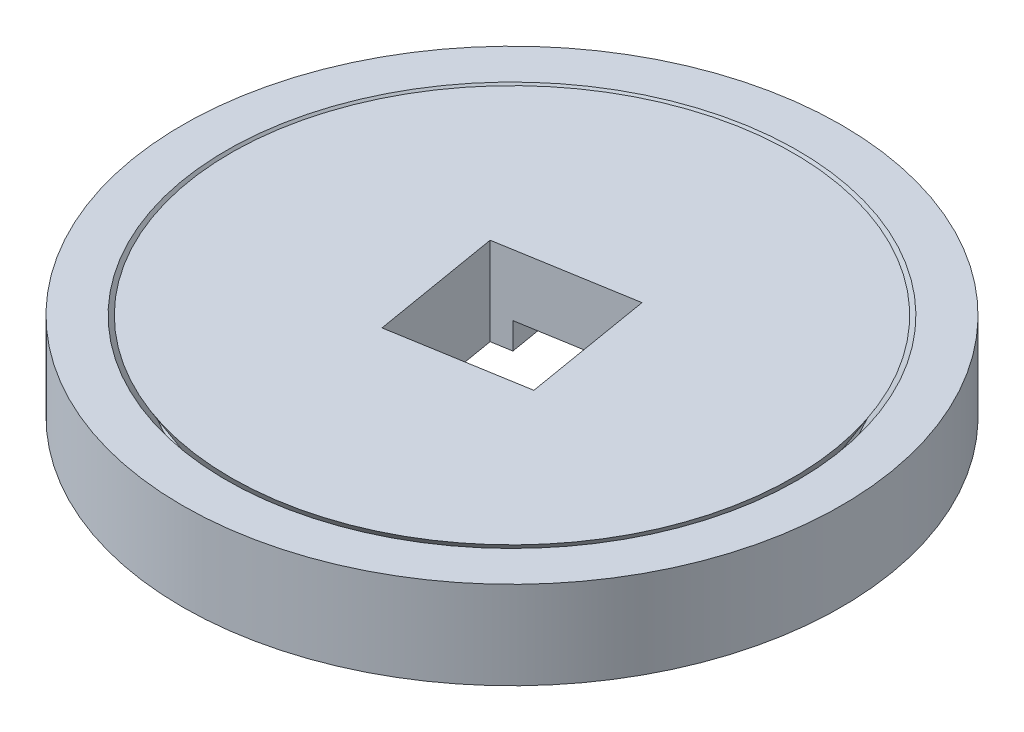
ISO-10303-21;
HEADER;
FILE_DESCRIPTION(('STEP AP214'),'2;1');
FILE_NAME('part.step','',(''),(''),'','','');
FILE_SCHEMA(('AUTOMOTIVE_DESIGN { 1 0 10303 214 1 1 1 1 }'));
ENDSEC;
DATA;
#1=APPLICATION_CONTEXT('core data for automotive mechanical design processes');
#2=APPLICATION_PROTOCOL_DEFINITION('international standard','automotive_design',2000,#1);
#3=PRODUCT_CONTEXT('',#1,'mechanical');
#4=PRODUCT('Part','Part','',(#3));
#5=PRODUCT_RELATED_PRODUCT_CATEGORY('part','',(#4));
#6=PRODUCT_DEFINITION_FORMATION('','',#4);
#7=PRODUCT_DEFINITION_CONTEXT('part definition',#1,'design');
#8=PRODUCT_DEFINITION('design','',#6,#7);
#9=PRODUCT_DEFINITION_SHAPE('','',#8);
#10=(LENGTH_UNIT() NAMED_UNIT(*) SI_UNIT(.MILLI.,.METRE.));
#11=(NAMED_UNIT(*) PLANE_ANGLE_UNIT() SI_UNIT($,.RADIAN.));
#12=(NAMED_UNIT(*) SI_UNIT($,.STERADIAN.) SOLID_ANGLE_UNIT());
#13=UNCERTAINTY_MEASURE_WITH_UNIT(LENGTH_MEASURE(1.E-05),#10,'distance_accuracy_value','');
#14=(GEOMETRIC_REPRESENTATION_CONTEXT(3) GLOBAL_UNCERTAINTY_ASSIGNED_CONTEXT((#13)) GLOBAL_UNIT_ASSIGNED_CONTEXT((#10,
#11,#12)) REPRESENTATION_CONTEXT('',''));
#15=CARTESIAN_POINT('',(0.,0.,0.));
#16=DIRECTION('',(0.,0.,1.));
#17=DIRECTION('',(1.,0.,0.));
#18=AXIS2_PLACEMENT_3D('',#15,#16,#17);
#19=CARTESIAN_POINT('',(0.,0.,0.));
#20=DIRECTION('',(0.,1.,0.));
#21=DIRECTION('',(0.165939621193172,0.,0.986135914627526));
#22=AXIS2_PLACEMENT_3D('',#19,#20,#21);
#23=PLANE('',#22);
#24=CARTESIAN_POINT('',(0.,0.,0.));
#25=DIRECTION('',(0.,1.,0.));
#26=DIRECTION('',(0.165939621193172,0.,0.986135914627526));
#27=AXIS2_PLACEMENT_3D('',#24,#25,#26);
#28=CIRCLE('',#27,32.);
#29=CARTESIAN_POINT('',(31.5563492680808,0.,-5.3100678781815));
#30=VERTEX_POINT('',#29);
#31=EDGE_CURVE('P0_E19',#30,#30,#28,.T.);
#32=ORIENTED_EDGE('',*,*,#31,.F.);
#33=EDGE_LOOP('',(#32));
#34=FACE_BOUND('',#33,.T.);
#35=DIRECTION('',(0.165939621193172,0.,0.986135914627526));
#36=VECTOR('',#35,1.);
#37=CARTESIAN_POINT('',(6.4217607107433,0.,6.5248363484423));
#38=LINE('',#37,#36);
#39=CARTESIAN_POINT('',(6.4217607107433,0.,6.5248363484423));
#40=VERTEX_POINT('',#39);
#41=CARTESIAN_POINT('',(8.1641267332716,0.,16.8792634520313));
#42=VERTEX_POINT('',#41);
#43=EDGE_CURVE('P0_E125',#40,#42,#38,.T.);
#44=ORIENTED_EDGE('',*,*,#43,.F.);
#45=DIRECTION('',(0.986135914627526,0.,-0.165939621193172));
#46=VECTOR('',#45,1.);
#47=CARTESIAN_POINT('',(-6.15147220075766,0.,8.64056651865523));
#48=LINE('',#47,#46);
#49=CARTESIAN_POINT('',(8.64056651865523,0.,6.15147220075765));
#50=VERTEX_POINT('',#49);
#51=EDGE_CURVE('P0_E190',#40,#50,#48,.T.);
#52=ORIENTED_EDGE('',*,*,#51,.T.);
#53=DIRECTION('',(-0.165939621193172,0.,-0.986135914627526));
#54=VECTOR('',#53,1.);
#55=CARTESIAN_POINT('',(8.64056651865523,0.,6.15147220075765));
#56=LINE('',#55,#54);
#57=CARTESIAN_POINT('',(6.15147220075765,0.,-8.64056651865523));
#58=VERTEX_POINT('',#57);
#59=EDGE_CURVE('P0_E176',#50,#58,#56,.T.);
#60=ORIENTED_EDGE('',*,*,#59,.T.);
#61=DIRECTION('',(-0.986135914627526,0.,0.165939621193172));
#62=VECTOR('',#61,1.);
#63=CARTESIAN_POINT('',(-8.64056651865523,0.,-6.15147220075765));
#64=LINE('',#63,#62);
#65=CARTESIAN_POINT('',(3.93266639284572,0.,-8.2672023709706));
#66=VERTEX_POINT('',#65);
#67=EDGE_CURVE('P0_E185',#58,#66,#64,.T.);
#68=ORIENTED_EDGE('',*,*,#67,.T.);
#69=DIRECTION('',(0.165939621193172,0.,0.986135914627526));
#70=VECTOR('',#69,1.);
#71=CARTESIAN_POINT('',(3.93266639284572,0.,-8.2672023709706));
#72=LINE('',#71,#70);
#73=CARTESIAN_POINT('',(2.19030037031742,0.,-18.6216294745596));
#74=VERTEX_POINT('',#73);
#75=EDGE_CURVE('P0_E141',#74,#66,#72,.T.);
#76=ORIENTED_EDGE('',*,*,#75,.F.);
#77=DIRECTION('',(0.986135914627526,0.,-0.165939621193172));
#78=VECTOR('',#77,1.);
#79=CARTESIAN_POINT('',(2.19030037031742,0.,-18.6216294745596));
#80=LINE('',#79,#78);
#81=CARTESIAN_POINT('',(-8.1641267332716,0.,-16.8792634520313));
#82=VERTEX_POINT('',#81);
#83=EDGE_CURVE('P0_E165',#82,#74,#80,.T.);
#84=ORIENTED_EDGE('',*,*,#83,.F.);
#85=DIRECTION('',(-0.165939621193171,0.,-0.986135914627526));
#86=VECTOR('',#85,1.);
#87=CARTESIAN_POINT('',(-6.4217607107433,0.,-6.52483634844229));
#88=LINE('',#87,#86);
#89=CARTESIAN_POINT('',(-6.4217607107433,0.,-6.52483634844229));
#90=VERTEX_POINT('',#89);
#91=EDGE_CURVE('P0_E164',#90,#82,#88,.T.);
#92=ORIENTED_EDGE('',*,*,#91,.F.);
#93=CARTESIAN_POINT('',(-8.64056651865523,0.,-6.15147220075765));
#94=VERTEX_POINT('',#93);
#95=EDGE_CURVE('P0_E177',#90,#94,#64,.T.);
#96=ORIENTED_EDGE('',*,*,#95,.T.);
#97=DIRECTION('',(0.165939621193172,0.,0.986135914627526));
#98=VECTOR('',#97,1.);
#99=CARTESIAN_POINT('',(-6.15147220075766,0.,8.64056651865523));
#100=LINE('',#99,#98);
#101=CARTESIAN_POINT('',(-6.15147220075766,0.,8.64056651865523));
#102=VERTEX_POINT('',#101);
#103=EDGE_CURVE('P0_E182',#94,#102,#100,.T.);
#104=ORIENTED_EDGE('',*,*,#103,.T.);
#105=CARTESIAN_POINT('',(-3.93266639284572,0.,8.2672023709706));
#106=VERTEX_POINT('',#105);
#107=EDGE_CURVE('P0_E187',#102,#106,#48,.T.);
#108=ORIENTED_EDGE('',*,*,#107,.T.);
#109=DIRECTION('',(-0.165939621193172,0.,-0.986135914627526));
#110=VECTOR('',#109,1.);
#111=CARTESIAN_POINT('',(-3.93266639284572,0.,8.2672023709706));
#112=LINE('',#111,#110);
#113=CARTESIAN_POINT('',(-2.19030037031742,0.,18.6216294745596));
#114=VERTEX_POINT('',#113);
#115=EDGE_CURVE('P0_E134',#114,#106,#112,.T.);
#116=ORIENTED_EDGE('',*,*,#115,.F.);
#117=DIRECTION('',(-0.986135914627526,0.,0.165939621193172));
#118=VECTOR('',#117,1.);
#119=CARTESIAN_POINT('',(8.1641267332716,0.,16.8792634520313));
#120=LINE('',#119,#118);
#121=EDGE_CURVE('P0_E140',#42,#114,#120,.T.);
#122=ORIENTED_EDGE('',*,*,#121,.F.);
#123=EDGE_LOOP('',(#44,#52,#60,#68,#76,#84,#92,#96,#104,#108,#116,#122));
#124=FACE_BOUND('',#123,.T.);
#125=ADVANCED_FACE('P0_F16',(#34,#124),#23,.F.);
#126=CARTESIAN_POINT('',(0.,10.,0.));
#127=DIRECTION('',(0.,1.,0.));
#128=DIRECTION('',(0.165939621193172,0.,0.986135914627526));
#129=AXIS2_PLACEMENT_3D('',#126,#127,#128);
#130=PLANE('',#129);
#131=DIRECTION('',(-0.165939621193172,0.,-0.986135914627526));
#132=VECTOR('',#131,1.);
#133=CARTESIAN_POINT('',(8.64056651865523,10.,6.15147220075765));
#134=LINE('',#133,#132);
#135=CARTESIAN_POINT('',(8.64056651865523,10.,6.15147220075765));
#136=VERTEX_POINT('',#135);
#137=CARTESIAN_POINT('',(6.15147220075765,10.,-8.64056651865523));
#138=VERTEX_POINT('',#137);
#139=EDGE_CURVE('P0_E150',#136,#138,#134,.T.);
#140=ORIENTED_EDGE('',*,*,#139,.F.);
#141=DIRECTION('',(0.986135914627526,0.,-0.165939621193172));
#142=VECTOR('',#141,1.);
#143=CARTESIAN_POINT('',(-6.15147220075766,10.,8.64056651865523));
#144=LINE('',#143,#142);
#145=CARTESIAN_POINT('',(-6.15147220075766,10.,8.64056651865523));
#146=VERTEX_POINT('',#145);
#147=EDGE_CURVE('P0_E179',#146,#136,#144,.T.);
#148=ORIENTED_EDGE('',*,*,#147,.F.);
#149=DIRECTION('',(0.165939621193172,0.,0.986135914627526));
#150=VECTOR('',#149,1.);
#151=CARTESIAN_POINT('',(-6.15147220075766,10.,8.64056651865523));
#152=LINE('',#151,#150);
#153=CARTESIAN_POINT('',(-8.64056651865523,10.,-6.15147220075765));
#154=VERTEX_POINT('',#153);
#155=EDGE_CURVE('P0_E198',#154,#146,#152,.T.);
#156=ORIENTED_EDGE('',*,*,#155,.F.);
#157=DIRECTION('',(-0.986135914627526,0.,0.165939621193172));
#158=VECTOR('',#157,1.);
#159=CARTESIAN_POINT('',(-8.64056651865523,10.,-6.15147220075765));
#160=LINE('',#159,#158);
#161=EDGE_CURVE('P0_E194',#138,#154,#160,.T.);
#162=ORIENTED_EDGE('',*,*,#161,.F.);
#163=EDGE_LOOP('',(#140,#148,#156,#162));
#164=FACE_BOUND('',#163,.T.);
#165=CARTESIAN_POINT('',(0.,10.,0.));
#166=DIRECTION('',(0.,1.,0.));
#167=DIRECTION('',(0.165939621193172,0.,0.986135914627526));
#168=AXIS2_PLACEMENT_3D('',#165,#166,#167);
#169=CIRCLE('',#168,32.);
#170=CARTESIAN_POINT('',(31.5563492680808,10.,-5.3100678781815));
#171=VERTEX_POINT('',#170);
#172=EDGE_CURVE('P0_E10',#171,#171,#169,.T.);
#173=ORIENTED_EDGE('',*,*,#172,.T.);
#174=EDGE_LOOP('',(#173));
#175=FACE_BOUND('',#174,.T.);
#176=ADVANCED_FACE('P0_F223',(#164,#175),#130,.T.);
#177=CARTESIAN_POINT('',(0.,10.,0.));
#178=DIRECTION('',(0.,1.,0.));
#179=DIRECTION('',(0.165939621193172,0.,0.986135914627526));
#180=AXIS2_PLACEMENT_3D('',#177,#178,#179);
#181=CONICAL_SURFACE('',#180,32.,0.540419500270584);
#182=DIRECTION('',(-0.507362742350503,-0.857492925712544,0.0853752307611385));
#183=VECTOR('',#182,1.);
#184=CARTESIAN_POINT('',(31.5563492680808,10.,-5.3100678781815));
#185=LINE('',#184,#183);
#186=CARTESIAN_POINT('',(28.5979415241982,5.,-4.81224901460198));
#187=VERTEX_POINT('',#186);
#188=EDGE_CURVE('P0_E201',#171,#187,#185,.T.);
#189=ORIENTED_EDGE('',*,*,#188,.F.);
#190=ORIENTED_EDGE('',*,*,#172,.F.);
#191=ORIENTED_EDGE('',*,*,#188,.T.);
#192=CARTESIAN_POINT('',(0.,5.,0.));
#193=DIRECTION('',(0.,1.,0.));
#194=DIRECTION('',(0.986135914627526,0.,-0.165939621193172));
#195=AXIS2_PLACEMENT_3D('',#192,#193,#194);
#196=CIRCLE('',#195,29.);
#197=EDGE_CURVE('P0_E215',#187,#187,#196,.T.);
#198=ORIENTED_EDGE('',*,*,#197,.T.);
#199=EDGE_LOOP('',(#189,#190,#191,#198));
#200=FACE_BOUND('',#199,.T.);
#201=ADVANCED_FACE('P0_F225',(#200),#181,.T.);
#202=CARTESIAN_POINT('',(0.,5.,0.));
#203=DIRECTION('',(0.,-1.,0.));
#204=DIRECTION('',(-0.165939621193172,0.,-0.986135914627526));
#205=AXIS2_PLACEMENT_3D('',#202,#203,#204);
#206=CONICAL_SURFACE('',#205,29.,0.540419500270584);
#207=DIRECTION('',(0.507362742350503,-0.857492925712544,-0.0853752307611385));
#208=VECTOR('',#207,1.);
#209=CARTESIAN_POINT('',(28.5979415241982,5.,-4.81224901460198));
#210=LINE('',#209,#208);
#211=EDGE_CURVE('P0_E211',#187,#30,#210,.T.);
#212=ORIENTED_EDGE('',*,*,#211,.F.);
#213=ORIENTED_EDGE('',*,*,#197,.F.);
#214=ORIENTED_EDGE('',*,*,#211,.T.);
#215=ORIENTED_EDGE('',*,*,#31,.T.);
#216=EDGE_LOOP('',(#212,#213,#214,#215));
#217=FACE_BOUND('',#216,.T.);
#218=ADVANCED_FACE('P0_F218',(#217),#206,.T.);
#219=CARTESIAN_POINT('',(8.64056651865523,0.,6.15147220075765));
#220=DIRECTION('',(0.986135914627526,0.,-0.165939621193172));
#221=DIRECTION('',(-0.165939621193172,0.,-0.986135914627526));
#222=AXIS2_PLACEMENT_3D('',#219,#220,#221);
#223=PLANE('',#222);
#224=ORIENTED_EDGE('',*,*,#139,.T.);
#225=DIRECTION('',(0.,1.,0.));
#226=VECTOR('',#225,1.);
#227=CARTESIAN_POINT('',(6.15147220075765,0.,-8.64056651865523));
#228=LINE('',#227,#226);
#229=EDGE_CURVE('P0_E192',#58,#138,#228,.T.);
#230=ORIENTED_EDGE('',*,*,#229,.F.);
#231=ORIENTED_EDGE('',*,*,#59,.F.);
#232=DIRECTION('',(0.,1.,0.));
#233=VECTOR('',#232,1.);
#234=CARTESIAN_POINT('',(8.64056651865523,0.,6.15147220075765));
#235=LINE('',#234,#233);
#236=EDGE_CURVE('P0_E203',#50,#136,#235,.T.);
#237=ORIENTED_EDGE('',*,*,#236,.T.);
#238=EDGE_LOOP('',(#224,#230,#231,#237));
#239=FACE_BOUND('',#238,.T.);
#240=ADVANCED_FACE('P0_F238',(#239),#223,.F.);
#241=CARTESIAN_POINT('',(-6.15147220075766,0.,8.64056651865523));
#242=DIRECTION('',(0.165939621193172,0.,0.986135914627526));
#243=DIRECTION('',(0.986135914627526,0.,-0.165939621193172));
#244=AXIS2_PLACEMENT_3D('',#241,#242,#243);
#245=PLANE('',#244);
#246=DIRECTION('',(0.986135914627526,0.,-0.165939621193172));
#247=VECTOR('',#246,1.);
#248=CARTESIAN_POINT('',(6.4217607107433,3.,6.5248363484423));
#249=LINE('',#248,#247);
#250=CARTESIAN_POINT('',(-3.93266639284572,3.,8.2672023709706));
#251=VERTEX_POINT('',#250);
#252=CARTESIAN_POINT('',(6.4217607107433,3.,6.5248363484423));
#253=VERTEX_POINT('',#252);
#254=EDGE_CURVE('P0_E126',#251,#253,#249,.T.);
#255=ORIENTED_EDGE('',*,*,#254,.F.);
#256=DIRECTION('',(0.,-1.,0.));
#257=VECTOR('',#256,1.);
#258=CARTESIAN_POINT('',(-3.93266639284572,3.,8.2672023709706));
#259=LINE('',#258,#257);
#260=EDGE_CURVE('P0_E146',#251,#106,#259,.T.);
#261=ORIENTED_EDGE('',*,*,#260,.T.);
#262=ORIENTED_EDGE('',*,*,#107,.F.);
#263=DIRECTION('',(0.,1.,0.));
#264=VECTOR('',#263,1.);
#265=CARTESIAN_POINT('',(-6.15147220075766,0.,8.64056651865523));
#266=LINE('',#265,#264);
#267=EDGE_CURVE('P0_E204',#102,#146,#266,.T.);
#268=ORIENTED_EDGE('',*,*,#267,.T.);
#269=ORIENTED_EDGE('',*,*,#147,.T.);
#270=ORIENTED_EDGE('',*,*,#236,.F.);
#271=ORIENTED_EDGE('',*,*,#51,.F.);
#272=DIRECTION('',(0.,-1.,0.));
#273=VECTOR('',#272,1.);
#274=CARTESIAN_POINT('',(6.4217607107433,3.,6.5248363484423));
#275=LINE('',#274,#273);
#276=EDGE_CURVE('P0_E144',#253,#40,#275,.T.);
#277=ORIENTED_EDGE('',*,*,#276,.F.);
#278=EDGE_LOOP('',(#255,#261,#262,#268,#269,#270,#271,#277));
#279=FACE_BOUND('',#278,.T.);
#280=ADVANCED_FACE('P0_F245',(#279),#245,.F.);
#281=CARTESIAN_POINT('',(-6.15147220075766,0.,8.64056651865523));
#282=DIRECTION('',(-0.986135914627526,0.,0.165939621193172));
#283=DIRECTION('',(0.165939621193172,0.,0.986135914627526));
#284=AXIS2_PLACEMENT_3D('',#281,#282,#283);
#285=PLANE('',#284);
#286=ORIENTED_EDGE('',*,*,#155,.T.);
#287=ORIENTED_EDGE('',*,*,#267,.F.);
#288=ORIENTED_EDGE('',*,*,#103,.F.);
#289=DIRECTION('',(0.,1.,0.));
#290=VECTOR('',#289,1.);
#291=CARTESIAN_POINT('',(-8.64056651865523,0.,-6.15147220075765));
#292=LINE('',#291,#290);
#293=EDGE_CURVE('P0_E206',#94,#154,#292,.T.);
#294=ORIENTED_EDGE('',*,*,#293,.T.);
#295=EDGE_LOOP('',(#286,#287,#288,#294));
#296=FACE_BOUND('',#295,.T.);
#297=ADVANCED_FACE('P0_F249',(#296),#285,.F.);
#298=CARTESIAN_POINT('',(-8.64056651865523,0.,-6.15147220075765));
#299=DIRECTION('',(-0.165939621193172,0.,-0.986135914627526));
#300=DIRECTION('',(-0.986135914627526,0.,0.165939621193172));
#301=AXIS2_PLACEMENT_3D('',#298,#299,#300);
#302=PLANE('',#301);
#303=DIRECTION('',(-0.986135914627526,0.,0.165939621193172));
#304=VECTOR('',#303,1.);
#305=CARTESIAN_POINT('',(3.93266639284572,3.,-8.2672023709706));
#306=LINE('',#305,#304);
#307=CARTESIAN_POINT('',(3.93266639284572,3.,-8.2672023709706));
#308=VERTEX_POINT('',#307);
#309=CARTESIAN_POINT('',(-6.4217607107433,3.,-6.52483634844229));
#310=VERTEX_POINT('',#309);
#311=EDGE_CURVE('P0_E174',#308,#310,#306,.T.);
#312=ORIENTED_EDGE('',*,*,#311,.F.);
#313=DIRECTION('',(0.,-1.,0.));
#314=VECTOR('',#313,1.);
#315=CARTESIAN_POINT('',(3.93266639284572,3.,-8.2672023709706));
#316=LINE('',#315,#314);
#317=EDGE_CURVE('P0_E155',#308,#66,#316,.T.);
#318=ORIENTED_EDGE('',*,*,#317,.T.);
#319=ORIENTED_EDGE('',*,*,#67,.F.);
#320=ORIENTED_EDGE('',*,*,#229,.T.);
#321=ORIENTED_EDGE('',*,*,#161,.T.);
#322=ORIENTED_EDGE('',*,*,#293,.F.);
#323=ORIENTED_EDGE('',*,*,#95,.F.);
#324=DIRECTION('',(0.,-1.,0.));
#325=VECTOR('',#324,1.);
#326=CARTESIAN_POINT('',(-6.4217607107433,3.,-6.52483634844229));
#327=LINE('',#326,#325);
#328=EDGE_CURVE('P0_E156',#310,#90,#327,.T.);
#329=ORIENTED_EDGE('',*,*,#328,.F.);
#330=EDGE_LOOP('',(#312,#318,#319,#320,#321,#322,#323,#329));
#331=FACE_BOUND('',#330,.T.);
#332=ADVANCED_FACE('P0_F243',(#331),#302,.F.);
#333=CARTESIAN_POINT('',(3.93266639284572,3.,-8.2672023709706));
#334=DIRECTION('',(0.986135914627526,0.,-0.165939621193172));
#335=DIRECTION('',(-0.165939621193172,0.,-0.986135914627526));
#336=AXIS2_PLACEMENT_3D('',#333,#334,#335);
#337=PLANE('',#336);
#338=ORIENTED_EDGE('',*,*,#75,.T.);
#339=ORIENTED_EDGE('',*,*,#317,.F.);
#340=DIRECTION('',(0.165939621193172,0.,0.986135914627526));
#341=VECTOR('',#340,1.);
#342=CARTESIAN_POINT('',(3.93266639284572,3.,-8.2672023709706));
#343=LINE('',#342,#341);
#344=CARTESIAN_POINT('',(2.19030037031742,3.,-18.6216294745596));
#345=VERTEX_POINT('',#344);
#346=EDGE_CURVE('P0_E36',#345,#308,#343,.T.);
#347=ORIENTED_EDGE('',*,*,#346,.F.);
#348=DIRECTION('',(0.,-1.,0.));
#349=VECTOR('',#348,1.);
#350=CARTESIAN_POINT('',(2.19030037031742,3.,-18.6216294745596));
#351=LINE('',#350,#349);
#352=EDGE_CURVE('P0_E159',#345,#74,#351,.T.);
#353=ORIENTED_EDGE('',*,*,#352,.T.);
#354=EDGE_LOOP('',(#338,#339,#347,#353));
#355=FACE_BOUND('',#354,.T.);
#356=ADVANCED_FACE('P0_F250',(#355),#337,.F.);
#357=CARTESIAN_POINT('',(2.19030037031742,3.,-18.6216294745596));
#358=DIRECTION('',(-0.165939621193172,0.,-0.986135914627526));
#359=DIRECTION('',(-0.986135914627526,0.,0.165939621193172));
#360=AXIS2_PLACEMENT_3D('',#357,#358,#359);
#361=PLANE('',#360);
#362=ORIENTED_EDGE('',*,*,#83,.T.);
#363=ORIENTED_EDGE('',*,*,#352,.F.);
#364=DIRECTION('',(0.986135914627526,0.,-0.165939621193172));
#365=VECTOR('',#364,1.);
#366=CARTESIAN_POINT('',(2.19030037031742,3.,-18.6216294745596));
#367=LINE('',#366,#365);
#368=CARTESIAN_POINT('',(-8.1641267332716,3.,-16.8792634520313));
#369=VERTEX_POINT('',#368);
#370=EDGE_CURVE('P0_E154',#369,#345,#367,.T.);
#371=ORIENTED_EDGE('',*,*,#370,.F.);
#372=DIRECTION('',(0.,-1.,0.));
#373=VECTOR('',#372,1.);
#374=CARTESIAN_POINT('',(-8.1641267332716,3.,-16.8792634520313));
#375=LINE('',#374,#373);
#376=EDGE_CURVE('P0_E158',#369,#82,#375,.T.);
#377=ORIENTED_EDGE('',*,*,#376,.T.);
#378=EDGE_LOOP('',(#362,#363,#371,#377));
#379=FACE_BOUND('',#378,.T.);
#380=ADVANCED_FACE('P0_F257',(#379),#361,.F.);
#381=CARTESIAN_POINT('',(-6.4217607107433,3.,-6.52483634844229));
#382=DIRECTION('',(-0.986135914627526,0.,0.165939621193171));
#383=DIRECTION('',(0.165939621193171,0.,0.986135914627526));
#384=AXIS2_PLACEMENT_3D('',#381,#382,#383);
#385=PLANE('',#384);
#386=ORIENTED_EDGE('',*,*,#91,.T.);
#387=ORIENTED_EDGE('',*,*,#376,.F.);
#388=DIRECTION('',(-0.165939621193171,0.,-0.986135914627526));
#389=VECTOR('',#388,1.);
#390=CARTESIAN_POINT('',(-6.4217607107433,3.,-6.52483634844229));
#391=LINE('',#390,#389);
#392=EDGE_CURVE('P0_E168',#310,#369,#391,.T.);
#393=ORIENTED_EDGE('',*,*,#392,.F.);
#394=ORIENTED_EDGE('',*,*,#328,.T.);
#395=EDGE_LOOP('',(#386,#387,#393,#394));
#396=FACE_BOUND('',#395,.T.);
#397=ADVANCED_FACE('P0_F259',(#396),#385,.F.);
#398=CARTESIAN_POINT('',(0.,3.,0.));
#399=DIRECTION('',(0.,1.,0.));
#400=DIRECTION('',(0.165939621193172,0.,0.986135914627526));
#401=AXIS2_PLACEMENT_3D('',#398,#399,#400);
#402=PLANE('',#401);
#403=ORIENTED_EDGE('',*,*,#346,.T.);
#404=ORIENTED_EDGE('',*,*,#311,.T.);
#405=ORIENTED_EDGE('',*,*,#392,.T.);
#406=ORIENTED_EDGE('',*,*,#370,.T.);
#407=EDGE_LOOP('',(#403,#404,#405,#406));
#408=FACE_BOUND('',#407,.T.);
#409=ADVANCED_FACE('P0_F258',(#408),#402,.F.);
#410=CARTESIAN_POINT('',(6.4217607107433,3.,6.5248363484423));
#411=DIRECTION('',(0.986135914627526,0.,-0.165939621193172));
#412=DIRECTION('',(-0.165939621193172,0.,-0.986135914627526));
#413=AXIS2_PLACEMENT_3D('',#410,#411,#412);
#414=PLANE('',#413);
#415=ORIENTED_EDGE('',*,*,#43,.T.);
#416=DIRECTION('',(0.,-1.,0.));
#417=VECTOR('',#416,1.);
#418=CARTESIAN_POINT('',(8.1641267332716,3.,16.8792634520313));
#419=LINE('',#418,#417);
#420=CARTESIAN_POINT('',(8.1641267332716,3.,16.8792634520313));
#421=VERTEX_POINT('',#420);
#422=EDGE_CURVE('P0_E116',#421,#42,#419,.T.);
#423=ORIENTED_EDGE('',*,*,#422,.F.);
#424=DIRECTION('',(0.165939621193172,0.,0.986135914627526));
#425=VECTOR('',#424,1.);
#426=CARTESIAN_POINT('',(6.4217607107433,3.,6.5248363484423));
#427=LINE('',#426,#425);
#428=EDGE_CURVE('P0_E120',#253,#421,#427,.T.);
#429=ORIENTED_EDGE('',*,*,#428,.F.);
#430=ORIENTED_EDGE('',*,*,#276,.T.);
#431=EDGE_LOOP('',(#415,#423,#429,#430));
#432=FACE_BOUND('',#431,.T.);
#433=ADVANCED_FACE('P0_F119',(#432),#414,.F.);
#434=CARTESIAN_POINT('',(-3.93266639284572,3.,8.2672023709706));
#435=DIRECTION('',(-0.986135914627526,0.,0.165939621193172));
#436=DIRECTION('',(0.165939621193172,0.,0.986135914627526));
#437=AXIS2_PLACEMENT_3D('',#434,#435,#436);
#438=PLANE('',#437);
#439=ORIENTED_EDGE('',*,*,#115,.T.);
#440=ORIENTED_EDGE('',*,*,#260,.F.);
#441=DIRECTION('',(-0.165939621193172,0.,-0.986135914627526));
#442=VECTOR('',#441,1.);
#443=CARTESIAN_POINT('',(-3.93266639284572,3.,8.2672023709706));
#444=LINE('',#443,#442);
#445=CARTESIAN_POINT('',(-2.19030037031742,3.,18.6216294745596));
#446=VERTEX_POINT('',#445);
#447=EDGE_CURVE('P0_E28',#446,#251,#444,.T.);
#448=ORIENTED_EDGE('',*,*,#447,.F.);
#449=DIRECTION('',(0.,-1.,0.));
#450=VECTOR('',#449,1.);
#451=CARTESIAN_POINT('',(-2.19030037031742,3.,18.6216294745596));
#452=LINE('',#451,#450);
#453=EDGE_CURVE('P0_E130',#446,#114,#452,.T.);
#454=ORIENTED_EDGE('',*,*,#453,.T.);
#455=EDGE_LOOP('',(#439,#440,#448,#454));
#456=FACE_BOUND('',#455,.T.);
#457=ADVANCED_FACE('P0_F275',(#456),#438,.F.);
#458=CARTESIAN_POINT('',(8.1641267332716,3.,16.8792634520313));
#459=DIRECTION('',(0.165939621193172,0.,0.986135914627526));
#460=DIRECTION('',(0.986135914627526,0.,-0.165939621193172));
#461=AXIS2_PLACEMENT_3D('',#458,#459,#460);
#462=PLANE('',#461);
#463=ORIENTED_EDGE('',*,*,#121,.T.);
#464=ORIENTED_EDGE('',*,*,#453,.F.);
#465=DIRECTION('',(-0.986135914627526,0.,0.165939621193172));
#466=VECTOR('',#465,1.);
#467=CARTESIAN_POINT('',(8.1641267332716,3.,16.8792634520313));
#468=LINE('',#467,#466);
#469=EDGE_CURVE('P0_E127',#421,#446,#468,.T.);
#470=ORIENTED_EDGE('',*,*,#469,.F.);
#471=ORIENTED_EDGE('',*,*,#422,.T.);
#472=EDGE_LOOP('',(#463,#464,#470,#471));
#473=FACE_BOUND('',#472,.T.);
#474=ADVANCED_FACE('P0_F129',(#473),#462,.F.);
#475=CARTESIAN_POINT('',(0.,3.,0.));
#476=DIRECTION('',(0.,-1.,0.));
#477=DIRECTION('',(-0.165939621193172,0.,-0.986135914627526));
#478=AXIS2_PLACEMENT_3D('',#475,#476,#477);
#479=PLANE('',#478);
#480=ORIENTED_EDGE('',*,*,#428,.T.);
#481=ORIENTED_EDGE('',*,*,#469,.T.);
#482=ORIENTED_EDGE('',*,*,#447,.T.);
#483=ORIENTED_EDGE('',*,*,#254,.T.);
#484=EDGE_LOOP('',(#480,#481,#482,#483));
#485=FACE_BOUND('',#484,.T.);
#486=ADVANCED_FACE('P0_F135',(#485),#479,.T.);
#487=CLOSED_SHELL('',(#125,#176,#201,#218,#240,#280,#297,#332,#356,#380,#397,#409,#433,#457,
#474,#486));
#488=MANIFOLD_SOLID_BREP('P0_B1',#487);
#489=CARTESIAN_POINT('',(0.,10.,0.));
#490=DIRECTION('',(0.,1.,0.));
#491=DIRECTION('',(0.,0.,1.));
#492=AXIS2_PLACEMENT_3D('',#489,#490,#491);
#493=PLANE('',#492);
#494=CARTESIAN_POINT('',(0.,10.,0.));
#495=DIRECTION('',(0.,1.,0.));
#496=DIRECTION('',(0.,0.,1.));
#497=AXIS2_PLACEMENT_3D('',#494,#495,#496);
#498=CIRCLE('',#497,37.5);
#499=CARTESIAN_POINT('',(0.,10.,37.5));
#500=VERTEX_POINT('',#499);
#501=EDGE_CURVE('P1_E11',#500,#500,#498,.T.);
#502=ORIENTED_EDGE('',*,*,#501,.T.);
#503=EDGE_LOOP('',(#502));
#504=FACE_BOUND('',#503,.T.);
#505=CARTESIAN_POINT('',(0.,10.,0.));
#506=DIRECTION('',(0.,1.,0.));
#507=DIRECTION('',(0.,0.,1.));
#508=AXIS2_PLACEMENT_3D('',#505,#506,#507);
#509=CIRCLE('',#508,32.5);
#510=CARTESIAN_POINT('',(32.5,10.,0.));
#511=VERTEX_POINT('',#510);
#512=EDGE_CURVE('P1_E40',#511,#511,#509,.T.);
#513=ORIENTED_EDGE('',*,*,#512,.F.);
#514=EDGE_LOOP('',(#513));
#515=FACE_BOUND('',#514,.T.);
#516=ADVANCED_FACE('P1_F17',(#504,#515),#493,.T.);
#517=CARTESIAN_POINT('',(0.,0.,0.));
#518=DIRECTION('',(0.,1.,0.));
#519=DIRECTION('',(0.,0.,1.));
#520=AXIS2_PLACEMENT_3D('',#517,#518,#519);
#521=PLANE('',#520);
#522=CARTESIAN_POINT('',(0.,0.,0.));
#523=DIRECTION('',(0.,1.,0.));
#524=DIRECTION('',(0.,0.,1.));
#525=AXIS2_PLACEMENT_3D('',#522,#523,#524);
#526=CIRCLE('',#525,37.5);
#527=CARTESIAN_POINT('',(0.,0.,37.5));
#528=VERTEX_POINT('',#527);
#529=EDGE_CURVE('P1_E21',#528,#528,#526,.T.);
#530=ORIENTED_EDGE('',*,*,#529,.F.);
#531=EDGE_LOOP('',(#530));
#532=FACE_BOUND('',#531,.T.);
#533=CARTESIAN_POINT('',(0.,0.,0.));
#534=DIRECTION('',(0.,1.,0.));
#535=DIRECTION('',(0.,0.,1.));
#536=AXIS2_PLACEMENT_3D('',#533,#534,#535);
#537=CIRCLE('',#536,32.5);
#538=CARTESIAN_POINT('',(32.5,0.,0.));
#539=VERTEX_POINT('',#538);
#540=EDGE_CURVE('P1_E32',#539,#539,#537,.T.);
#541=ORIENTED_EDGE('',*,*,#540,.T.);
#542=EDGE_LOOP('',(#541));
#543=FACE_BOUND('',#542,.T.);
#544=ADVANCED_FACE('P1_F55',(#532,#543),#521,.F.);
#545=CARTESIAN_POINT('',(0.,10.,0.));
#546=DIRECTION('',(0.,-1.,0.));
#547=DIRECTION('',(0.,0.,-1.));
#548=AXIS2_PLACEMENT_3D('',#545,#546,#547);
#549=CYLINDRICAL_SURFACE('',#548,37.5);
#550=ORIENTED_EDGE('',*,*,#501,.F.);
#551=EDGE_LOOP('',(#550));
#552=FACE_BOUND('',#551,.T.);
#553=ORIENTED_EDGE('',*,*,#529,.T.);
#554=EDGE_LOOP('',(#553));
#555=FACE_BOUND('',#554,.T.);
#556=ADVANCED_FACE('P1_F19',(#552,#555),#549,.T.);
#557=CARTESIAN_POINT('',(0.,5.,0.));
#558=DIRECTION('',(0.,-1.,0.));
#559=DIRECTION('',(0.,0.,-1.));
#560=AXIS2_PLACEMENT_3D('',#557,#558,#559);
#561=CONICAL_SURFACE('',#560,29.5,0.540419500270584);
#562=DIRECTION('',(0.514495755427526,-0.857492925712544,0.));
#563=VECTOR('',#562,1.);
#564=CARTESIAN_POINT('',(29.5,5.,0.));
#565=LINE('',#564,#563);
#566=CARTESIAN_POINT('',(29.5,5.,0.));
#567=VERTEX_POINT('',#566);
#568=EDGE_CURVE('P1_E37',#567,#539,#565,.T.);
#569=ORIENTED_EDGE('',*,*,#568,.T.);
#570=ORIENTED_EDGE('',*,*,#540,.F.);
#571=ORIENTED_EDGE('',*,*,#568,.F.);
#572=CARTESIAN_POINT('',(0.,5.,0.));
#573=DIRECTION('',(0.,1.,0.));
#574=DIRECTION('',(1.,0.,0.));
#575=AXIS2_PLACEMENT_3D('',#572,#573,#574);
#576=CIRCLE('',#575,29.5);
#577=EDGE_CURVE('P1_E43',#567,#567,#576,.T.);
#578=ORIENTED_EDGE('',*,*,#577,.T.);
#579=EDGE_LOOP('',(#569,#570,#571,#578));
#580=FACE_BOUND('',#579,.T.);
#581=ADVANCED_FACE('P1_F41',(#580),#561,.F.);
#582=CARTESIAN_POINT('',(0.,10.,0.));
#583=DIRECTION('',(0.,1.,0.));
#584=DIRECTION('',(0.,0.,1.));
#585=AXIS2_PLACEMENT_3D('',#582,#583,#584);
#586=CONICAL_SURFACE('',#585,32.5,0.540419500270584);
#587=DIRECTION('',(-0.514495755427526,-0.857492925712544,0.));
#588=VECTOR('',#587,1.);
#589=CARTESIAN_POINT('',(32.5,10.,0.));
#590=LINE('',#589,#588);
#591=EDGE_CURVE('P1_E42',#511,#567,#590,.T.);
#592=ORIENTED_EDGE('',*,*,#591,.T.);
#593=ORIENTED_EDGE('',*,*,#577,.F.);
#594=ORIENTED_EDGE('',*,*,#591,.F.);
#595=ORIENTED_EDGE('',*,*,#512,.T.);
#596=EDGE_LOOP('',(#592,#593,#594,#595));
#597=FACE_BOUND('',#596,.T.);
#598=ADVANCED_FACE('P1_F67',(#597),#586,.F.);
#599=CLOSED_SHELL('',(#516,#544,#556,#581,#598));
#600=MANIFOLD_SOLID_BREP('P1_B1',#599);
#601=ADVANCED_BREP_SHAPE_REPRESENTATION('',(#18,#488,#600),#14);
#602=SHAPE_DEFINITION_REPRESENTATION(#9,#601);
ENDSEC;
END-ISO-10303-21;
